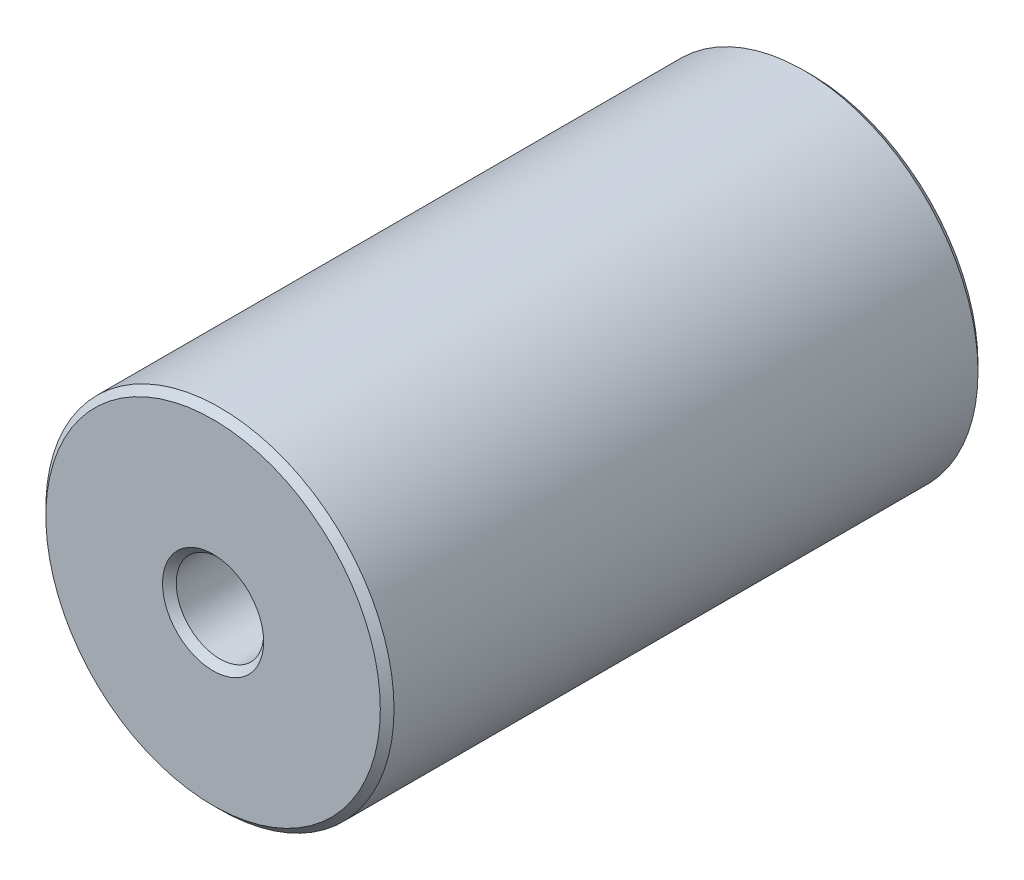
ISO-10303-21;
HEADER;
FILE_DESCRIPTION(('STEP AP214'),'2;1');
FILE_NAME('part.step','',(''),(''),'','','');
FILE_SCHEMA(('AUTOMOTIVE_DESIGN { 1 0 10303 214 1 1 1 1 }'));
ENDSEC;
DATA;
#1=APPLICATION_CONTEXT('core data for automotive mechanical design processes');
#2=APPLICATION_PROTOCOL_DEFINITION('international standard','automotive_design',2000,#1);
#3=PRODUCT_CONTEXT('',#1,'mechanical');
#4=PRODUCT('Part','Part','',(#3));
#5=PRODUCT_RELATED_PRODUCT_CATEGORY('part','',(#4));
#6=PRODUCT_DEFINITION_FORMATION('','',#4);
#7=PRODUCT_DEFINITION_CONTEXT('part definition',#1,'design');
#8=PRODUCT_DEFINITION('design','',#6,#7);
#9=PRODUCT_DEFINITION_SHAPE('','',#8);
#10=(LENGTH_UNIT() NAMED_UNIT(*) SI_UNIT(.MILLI.,.METRE.));
#11=(NAMED_UNIT(*) PLANE_ANGLE_UNIT() SI_UNIT($,.RADIAN.));
#12=(NAMED_UNIT(*) SI_UNIT($,.STERADIAN.) SOLID_ANGLE_UNIT());
#13=UNCERTAINTY_MEASURE_WITH_UNIT(LENGTH_MEASURE(1.E-05),#10,'distance_accuracy_value','');
#14=(GEOMETRIC_REPRESENTATION_CONTEXT(3) GLOBAL_UNCERTAINTY_ASSIGNED_CONTEXT((#13)) GLOBAL_UNIT_ASSIGNED_CONTEXT((#10,
#11,#12)) REPRESENTATION_CONTEXT('',''));
#15=CARTESIAN_POINT('',(0.,0.,0.));
#16=DIRECTION('',(0.,0.,1.));
#17=DIRECTION('',(1.,0.,0.));
#18=AXIS2_PLACEMENT_3D('',#15,#16,#17);
#19=CARTESIAN_POINT('',(0.,0.,43.6));
#20=DIRECTION('',(0.,0.,-1.));
#21=DIRECTION('',(-1.,0.,0.));
#22=AXIS2_PLACEMENT_3D('',#19,#20,#21);
#23=CYLINDRICAL_SURFACE('',#22,12.7);
#24=CARTESIAN_POINT('',(0.,0.,43.1));
#25=DIRECTION('',(0.,0.,1.));
#26=DIRECTION('',(1.,0.,0.));
#27=AXIS2_PLACEMENT_3D('',#24,#25,#26);
#28=CIRCLE('',#27,12.7);
#29=CARTESIAN_POINT('',(12.7,0.,43.1));
#30=VERTEX_POINT('',#29);
#31=EDGE_CURVE('E46',#30,#30,#28,.F.);
#32=ORIENTED_EDGE('',*,*,#31,.T.);
#33=EDGE_LOOP('',(#32));
#34=FACE_BOUND('',#33,.T.);
#35=CARTESIAN_POINT('',(0.,0.,0.5));
#36=DIRECTION('',(0.,0.,1.));
#37=DIRECTION('',(1.,0.,0.));
#38=AXIS2_PLACEMENT_3D('',#35,#36,#37);
#39=CIRCLE('',#38,12.7);
#40=CARTESIAN_POINT('',(12.7,0.,0.5));
#41=VERTEX_POINT('',#40);
#42=EDGE_CURVE('E51',#41,#41,#39,.T.);
#43=ORIENTED_EDGE('',*,*,#42,.T.);
#44=EDGE_LOOP('',(#43));
#45=FACE_BOUND('',#44,.T.);
#46=ADVANCED_FACE('F31',(#34,#45),#23,.T.);
#47=CARTESIAN_POINT('',(0.,0.,43.6));
#48=DIRECTION('',(0.,0.,1.));
#49=DIRECTION('',(1.,0.,0.));
#50=AXIS2_PLACEMENT_3D('',#47,#48,#49);
#51=PLANE('',#50);
#52=CARTESIAN_POINT('',(0.,0.,43.6));
#53=DIRECTION('',(0.,0.,1.));
#54=DIRECTION('',(1.,0.,0.));
#55=AXIS2_PLACEMENT_3D('',#52,#53,#54);
#56=CIRCLE('',#55,3.6877);
#57=CARTESIAN_POINT('',(3.6877,0.,43.6));
#58=VERTEX_POINT('',#57);
#59=EDGE_CURVE('E10',#58,#58,#56,.F.);
#60=ORIENTED_EDGE('',*,*,#59,.T.);
#61=EDGE_LOOP('',(#60));
#62=FACE_BOUND('',#61,.T.);
#63=CARTESIAN_POINT('',(0.,0.,43.6));
#64=DIRECTION('',(0.,0.,1.));
#65=DIRECTION('',(1.,0.,0.));
#66=AXIS2_PLACEMENT_3D('',#63,#64,#65);
#67=CIRCLE('',#66,12.2);
#68=CARTESIAN_POINT('',(12.2,0.,43.6));
#69=VERTEX_POINT('',#68);
#70=EDGE_CURVE('E54',#69,#69,#67,.T.);
#71=ORIENTED_EDGE('',*,*,#70,.T.);
#72=EDGE_LOOP('',(#71));
#73=FACE_BOUND('',#72,.T.);
#74=ADVANCED_FACE('F72',(#62,#73),#51,.T.);
#75=CARTESIAN_POINT('',(0.,0.,0.));
#76=DIRECTION('',(0.,0.,1.));
#77=DIRECTION('',(1.,0.,0.));
#78=AXIS2_PLACEMENT_3D('',#75,#76,#77);
#79=PLANE('',#78);
#80=CARTESIAN_POINT('',(0.,0.,0.));
#81=DIRECTION('',(0.,0.,1.));
#82=DIRECTION('',(1.,0.,0.));
#83=AXIS2_PLACEMENT_3D('',#80,#81,#82);
#84=CIRCLE('',#83,12.2);
#85=CARTESIAN_POINT('',(12.2,0.,0.));
#86=VERTEX_POINT('',#85);
#87=EDGE_CURVE('E42',#86,#86,#84,.F.);
#88=ORIENTED_EDGE('',*,*,#87,.T.);
#89=EDGE_LOOP('',(#88));
#90=FACE_BOUND('',#89,.T.);
#91=CARTESIAN_POINT('',(0.,0.,0.));
#92=DIRECTION('',(0.,0.,-1.));
#93=DIRECTION('',(-1.,0.,0.));
#94=AXIS2_PLACEMENT_3D('',#91,#92,#93);
#95=CIRCLE('',#94,3.85826);
#96=CARTESIAN_POINT('',(-3.85826,0.,0.));
#97=VERTEX_POINT('',#96);
#98=EDGE_CURVE('E63',#97,#97,#95,.T.);
#99=ORIENTED_EDGE('',*,*,#98,.F.);
#100=EDGE_LOOP('',(#99));
#101=FACE_BOUND('',#100,.T.);
#102=ADVANCED_FACE('F69',(#90,#101),#79,.F.);
#103=CARTESIAN_POINT('',(0.,0.,0.));
#104=DIRECTION('',(0.,0.,1.));
#105=DIRECTION('',(1.,0.,0.));
#106=AXIS2_PLACEMENT_3D('',#103,#104,#105);
#107=CYLINDRICAL_SURFACE('',#106,3.1877);
#108=CARTESIAN_POINT('',(0.,0.,43.1));
#109=DIRECTION('',(0.,0.,1.));
#110=DIRECTION('',(1.,0.,0.));
#111=AXIS2_PLACEMENT_3D('',#108,#109,#110);
#112=CIRCLE('',#111,3.1877);
#113=CARTESIAN_POINT('',(3.1877,0.,43.1));
#114=VERTEX_POINT('',#113);
#115=EDGE_CURVE('E38',#114,#114,#112,.T.);
#116=ORIENTED_EDGE('',*,*,#115,.T.);
#117=EDGE_LOOP('',(#116));
#118=FACE_BOUND('',#117,.T.);
#119=CARTESIAN_POINT('',(0.,0.,19.1989130966951));
#120=DIRECTION('',(0.,0.,-1.));
#121=DIRECTION('',(-1.,0.,0.));
#122=AXIS2_PLACEMENT_3D('',#119,#120,#121);
#123=CIRCLE('',#122,3.1877);
#124=CARTESIAN_POINT('',(-3.1877,0.,19.1989130966951));
#125=VERTEX_POINT('',#124);
#126=EDGE_CURVE('E57',#125,#125,#123,.T.);
#127=ORIENTED_EDGE('',*,*,#126,.T.);
#128=EDGE_LOOP('',(#127));
#129=FACE_BOUND('',#128,.T.);
#130=ADVANCED_FACE('F71',(#118,#129),#107,.F.);
#131=CARTESIAN_POINT('',(0.,0.,18.796));
#132=DIRECTION('',(0.,0.,-1.));
#133=DIRECTION('',(-1.,0.,0.));
#134=AXIS2_PLACEMENT_3D('',#131,#132,#133);
#135=CONICAL_SURFACE('',#134,3.85826,1.02974425867665);
#136=CARTESIAN_POINT('',(0.,0.,18.796));
#137=DIRECTION('',(0.,0.,-1.));
#138=DIRECTION('',(-1.,0.,0.));
#139=AXIS2_PLACEMENT_3D('',#136,#137,#138);
#140=CIRCLE('',#139,3.85826);
#141=CARTESIAN_POINT('',(-3.85826,0.,18.796));
#142=VERTEX_POINT('',#141);
#143=EDGE_CURVE('E60',#142,#142,#140,.T.);
#144=ORIENTED_EDGE('',*,*,#143,.T.);
#145=EDGE_LOOP('',(#144));
#146=FACE_BOUND('',#145,.T.);
#147=ORIENTED_EDGE('',*,*,#126,.F.);
#148=EDGE_LOOP('',(#147));
#149=FACE_BOUND('',#148,.T.);
#150=ADVANCED_FACE('F79',(#146,#149),#135,.F.);
#151=CARTESIAN_POINT('',(0.,0.,0.));
#152=DIRECTION('',(0.,0.,-1.));
#153=DIRECTION('',(-1.,0.,0.));
#154=AXIS2_PLACEMENT_3D('',#151,#152,#153);
#155=CYLINDRICAL_SURFACE('',#154,3.85826);
#156=ORIENTED_EDGE('',*,*,#143,.F.);
#157=EDGE_LOOP('',(#156));
#158=FACE_BOUND('',#157,.T.);
#159=ORIENTED_EDGE('',*,*,#98,.T.);
#160=EDGE_LOOP('',(#159));
#161=FACE_BOUND('',#160,.T.);
#162=ADVANCED_FACE('F67',(#158,#161),#155,.F.);
#163=CARTESIAN_POINT('',(0.,0.,43.6));
#164=DIRECTION('',(0.,0.,-1.));
#165=DIRECTION('',(-1.,0.,0.));
#166=AXIS2_PLACEMENT_3D('',#163,#164,#165);
#167=CONICAL_SURFACE('',#166,12.2,0.785398163397445);
#168=ORIENTED_EDGE('',*,*,#31,.F.);
#169=EDGE_LOOP('',(#168));
#170=FACE_BOUND('',#169,.T.);
#171=ORIENTED_EDGE('',*,*,#70,.F.);
#172=EDGE_LOOP('',(#171));
#173=FACE_BOUND('',#172,.T.);
#174=ADVANCED_FACE('F89',(#170,#173),#167,.T.);
#175=CARTESIAN_POINT('',(0.,0.,0.5));
#176=DIRECTION('',(0.,0.,1.));
#177=DIRECTION('',(1.,0.,0.));
#178=AXIS2_PLACEMENT_3D('',#175,#176,#177);
#179=CONICAL_SURFACE('',#178,12.7,0.785398163397447);
#180=ORIENTED_EDGE('',*,*,#87,.F.);
#181=EDGE_LOOP('',(#180));
#182=FACE_BOUND('',#181,.T.);
#183=ORIENTED_EDGE('',*,*,#42,.F.);
#184=EDGE_LOOP('',(#183));
#185=FACE_BOUND('',#184,.T.);
#186=ADVANCED_FACE('F91',(#182,#185),#179,.T.);
#187=CARTESIAN_POINT('',(0.,0.,43.1));
#188=DIRECTION('',(0.,0.,1.));
#189=DIRECTION('',(1.,0.,0.));
#190=AXIS2_PLACEMENT_3D('',#187,#188,#189);
#191=CONICAL_SURFACE('',#190,3.1877,0.785398163397443);
#192=ORIENTED_EDGE('',*,*,#59,.F.);
#193=EDGE_LOOP('',(#192));
#194=FACE_BOUND('',#193,.T.);
#195=ORIENTED_EDGE('',*,*,#115,.F.);
#196=EDGE_LOOP('',(#195));
#197=FACE_BOUND('',#196,.T.);
#198=ADVANCED_FACE('F33',(#194,#197),#191,.F.);
#199=CLOSED_SHELL('',(#46,#74,#102,#130,#150,#162,#174,#186,#198));
#200=MANIFOLD_SOLID_BREP('B2',#199);
#201=ADVANCED_BREP_SHAPE_REPRESENTATION('',(#18,#200),#14);
#202=SHAPE_DEFINITION_REPRESENTATION(#9,#201);
ENDSEC;
END-ISO-10303-21;
